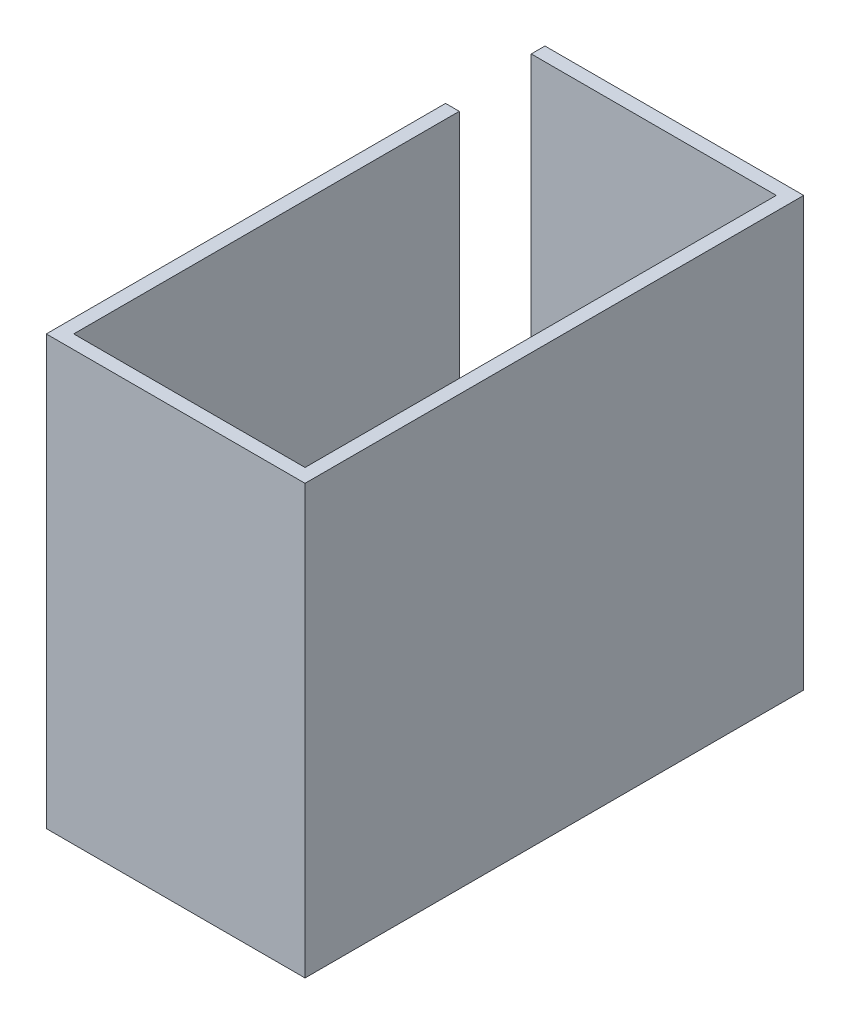
ISO-10303-21;
HEADER;
FILE_DESCRIPTION(('STEP AP214'),'2;1');
FILE_NAME('part.step','',(''),(''),'','','');
FILE_SCHEMA(('AUTOMOTIVE_DESIGN { 1 0 10303 214 1 1 1 1 }'));
ENDSEC;
DATA;
#1=APPLICATION_CONTEXT('core data for automotive mechanical design processes');
#2=APPLICATION_PROTOCOL_DEFINITION('international standard','automotive_design',2000,#1);
#3=PRODUCT_CONTEXT('',#1,'mechanical');
#4=PRODUCT('Part','Part','',(#3));
#5=PRODUCT_RELATED_PRODUCT_CATEGORY('part','',(#4));
#6=PRODUCT_DEFINITION_FORMATION('','',#4);
#7=PRODUCT_DEFINITION_CONTEXT('part definition',#1,'design');
#8=PRODUCT_DEFINITION('design','',#6,#7);
#9=PRODUCT_DEFINITION_SHAPE('','',#8);
#10=(LENGTH_UNIT() NAMED_UNIT(*) SI_UNIT(.MILLI.,.METRE.));
#11=(NAMED_UNIT(*) PLANE_ANGLE_UNIT() SI_UNIT($,.RADIAN.));
#12=(NAMED_UNIT(*) SI_UNIT($,.STERADIAN.) SOLID_ANGLE_UNIT());
#13=UNCERTAINTY_MEASURE_WITH_UNIT(LENGTH_MEASURE(1.E-05),#10,'distance_accuracy_value','');
#14=(GEOMETRIC_REPRESENTATION_CONTEXT(3) GLOBAL_UNCERTAINTY_ASSIGNED_CONTEXT((#13)) GLOBAL_UNIT_ASSIGNED_CONTEXT((#10,
#11,#12)) REPRESENTATION_CONTEXT('',''));
#15=CARTESIAN_POINT('',(0.,0.,0.));
#16=DIRECTION('',(0.,0.,1.));
#17=DIRECTION('',(1.,0.,0.));
#18=AXIS2_PLACEMENT_3D('',#15,#16,#17);
#19=CARTESIAN_POINT('',(0.,50.,-34.1));
#20=DIRECTION('',(0.,0.,1.));
#21=DIRECTION('',(1.,0.,0.));
#22=AXIS2_PLACEMENT_3D('',#19,#20,#21);
#23=PLANE('',#22);
#24=DIRECTION('',(-1.,0.,0.));
#25=VECTOR('',#24,1.);
#26=CARTESIAN_POINT('',(0.,0.,-34.1));
#27=LINE('',#26,#25);
#28=CARTESIAN_POINT('',(15.1,0.,-34.1));
#29=VERTEX_POINT('',#28);
#30=CARTESIAN_POINT('',(-15.1,0.,-34.1));
#31=VERTEX_POINT('',#30);
#32=EDGE_CURVE('E127',#29,#31,#27,.T.);
#33=ORIENTED_EDGE('',*,*,#32,.T.);
#34=DIRECTION('',(0.,-1.,0.));
#35=VECTOR('',#34,1.);
#36=CARTESIAN_POINT('',(-15.1,50.,-34.1));
#37=LINE('',#36,#35);
#38=CARTESIAN_POINT('',(-15.1,50.,-34.1));
#39=VERTEX_POINT('',#38);
#40=EDGE_CURVE('E12',#39,#31,#37,.T.);
#41=ORIENTED_EDGE('',*,*,#40,.F.);
#42=DIRECTION('',(-1.,0.,0.));
#43=VECTOR('',#42,1.);
#44=CARTESIAN_POINT('',(0.,50.,-34.1));
#45=LINE('',#44,#43);
#46=CARTESIAN_POINT('',(15.1,50.,-34.1));
#47=VERTEX_POINT('',#46);
#48=EDGE_CURVE('E135',#47,#39,#45,.T.);
#49=ORIENTED_EDGE('',*,*,#48,.F.);
#50=DIRECTION('',(0.,-1.,0.));
#51=VECTOR('',#50,1.);
#52=CARTESIAN_POINT('',(15.1,50.,-34.1));
#53=LINE('',#52,#51);
#54=EDGE_CURVE('E123',#47,#29,#53,.T.);
#55=ORIENTED_EDGE('',*,*,#54,.T.);
#56=EDGE_LOOP('',(#33,#41,#49,#55));
#57=FACE_BOUND('',#56,.T.);
#58=ADVANCED_FACE('F37',(#57),#23,.F.);
#59=CARTESIAN_POINT('',(0.,50.,-32.5));
#60=DIRECTION('',(0.,0.,1.));
#61=DIRECTION('',(1.,0.,0.));
#62=AXIS2_PLACEMENT_3D('',#59,#60,#61);
#63=PLANE('',#62);
#64=DIRECTION('',(-1.,0.,0.));
#65=VECTOR('',#64,1.);
#66=CARTESIAN_POINT('',(0.,15.,-32.5));
#67=LINE('',#66,#65);
#68=CARTESIAN_POINT('',(13.5,15.,-32.5));
#69=VERTEX_POINT('',#68);
#70=CARTESIAN_POINT('',(-15.1,15.,-32.5));
#71=VERTEX_POINT('',#70);
#72=EDGE_CURVE('E130',#69,#71,#67,.T.);
#73=ORIENTED_EDGE('',*,*,#72,.F.);
#74=DIRECTION('',(0.,-1.,0.));
#75=VECTOR('',#74,1.);
#76=CARTESIAN_POINT('',(13.5,50.,-32.5));
#77=LINE('',#76,#75);
#78=CARTESIAN_POINT('',(13.5,50.,-32.5));
#79=VERTEX_POINT('',#78);
#80=EDGE_CURVE('E148',#79,#69,#77,.T.);
#81=ORIENTED_EDGE('',*,*,#80,.F.);
#82=DIRECTION('',(-1.,0.,0.));
#83=VECTOR('',#82,1.);
#84=CARTESIAN_POINT('',(0.,50.,-32.5));
#85=LINE('',#84,#83);
#86=CARTESIAN_POINT('',(-15.1,50.,-32.5));
#87=VERTEX_POINT('',#86);
#88=EDGE_CURVE('E158',#79,#87,#85,.T.);
#89=ORIENTED_EDGE('',*,*,#88,.T.);
#90=DIRECTION('',(0.,-1.,0.));
#91=VECTOR('',#90,1.);
#92=CARTESIAN_POINT('',(-15.1,50.,-32.5));
#93=LINE('',#92,#91);
#94=EDGE_CURVE('E45',#87,#71,#93,.T.);
#95=ORIENTED_EDGE('',*,*,#94,.T.);
#96=EDGE_LOOP('',(#73,#81,#89,#95));
#97=FACE_BOUND('',#96,.T.);
#98=ADVANCED_FACE('F154',(#97),#63,.T.);
#99=CARTESIAN_POINT('',(13.5,50.,0.));
#100=DIRECTION('',(-1.,0.,0.));
#101=DIRECTION('',(0.,0.,1.));
#102=AXIS2_PLACEMENT_3D('',#99,#100,#101);
#103=PLANE('',#102);
#104=DIRECTION('',(0.,0.,-1.));
#105=VECTOR('',#104,1.);
#106=CARTESIAN_POINT('',(13.5,15.,0.));
#107=LINE('',#106,#105);
#108=CARTESIAN_POINT('',(13.5,15.,22.5));
#109=VERTEX_POINT('',#108);
#110=EDGE_CURVE('E172',#109,#69,#107,.T.);
#111=ORIENTED_EDGE('',*,*,#110,.F.);
#112=DIRECTION('',(0.,-1.,0.));
#113=VECTOR('',#112,1.);
#114=CARTESIAN_POINT('',(13.5,50.,22.5));
#115=LINE('',#114,#113);
#116=CARTESIAN_POINT('',(13.5,50.,22.5));
#117=VERTEX_POINT('',#116);
#118=EDGE_CURVE('E145',#117,#109,#115,.T.);
#119=ORIENTED_EDGE('',*,*,#118,.F.);
#120=DIRECTION('',(0.,0.,-1.));
#121=VECTOR('',#120,1.);
#122=CARTESIAN_POINT('',(13.5,50.,0.));
#123=LINE('',#122,#121);
#124=EDGE_CURVE('E181',#117,#79,#123,.T.);
#125=ORIENTED_EDGE('',*,*,#124,.T.);
#126=ORIENTED_EDGE('',*,*,#80,.T.);
#127=EDGE_LOOP('',(#111,#119,#125,#126));
#128=FACE_BOUND('',#127,.T.);
#129=ADVANCED_FACE('F211',(#128),#103,.T.);
#130=CARTESIAN_POINT('',(0.,50.,22.5));
#131=DIRECTION('',(0.,0.,1.));
#132=DIRECTION('',(1.,0.,0.));
#133=AXIS2_PLACEMENT_3D('',#130,#131,#132);
#134=PLANE('',#133);
#135=ORIENTED_EDGE('',*,*,#118,.T.);
#136=DIRECTION('',(-1.,0.,0.));
#137=VECTOR('',#136,1.);
#138=CARTESIAN_POINT('',(0.,15.,22.5));
#139=LINE('',#138,#137);
#140=CARTESIAN_POINT('',(-13.5,15.,22.5));
#141=VERTEX_POINT('',#140);
#142=EDGE_CURVE('E194',#109,#141,#139,.T.);
#143=ORIENTED_EDGE('',*,*,#142,.T.);
#144=DIRECTION('',(0.,-1.,0.));
#145=VECTOR('',#144,1.);
#146=CARTESIAN_POINT('',(-13.5,50.,22.5));
#147=LINE('',#146,#145);
#148=CARTESIAN_POINT('',(-13.5,50.,22.5));
#149=VERTEX_POINT('',#148);
#150=EDGE_CURVE('E142',#149,#141,#147,.T.);
#151=ORIENTED_EDGE('',*,*,#150,.F.);
#152=DIRECTION('',(-1.,0.,0.));
#153=VECTOR('',#152,1.);
#154=CARTESIAN_POINT('',(0.,50.,22.5));
#155=LINE('',#154,#153);
#156=EDGE_CURVE('E184',#117,#149,#155,.T.);
#157=ORIENTED_EDGE('',*,*,#156,.F.);
#158=EDGE_LOOP('',(#135,#143,#151,#157));
#159=FACE_BOUND('',#158,.T.);
#160=ADVANCED_FACE('F207',(#159),#134,.F.);
#161=CARTESIAN_POINT('',(-13.5,50.,0.));
#162=DIRECTION('',(-1.,0.,0.));
#163=DIRECTION('',(0.,0.,1.));
#164=AXIS2_PLACEMENT_3D('',#161,#162,#163);
#165=PLANE('',#164);
#166=ORIENTED_EDGE('',*,*,#150,.T.);
#167=DIRECTION('',(0.,0.,-1.));
#168=VECTOR('',#167,1.);
#169=CARTESIAN_POINT('',(-13.5,15.,0.));
#170=LINE('',#169,#168);
#171=CARTESIAN_POINT('',(-13.5,15.,-22.5));
#172=VERTEX_POINT('',#171);
#173=EDGE_CURVE('E166',#141,#172,#170,.T.);
#174=ORIENTED_EDGE('',*,*,#173,.T.);
#175=DIRECTION('',(0.,-1.,0.));
#176=VECTOR('',#175,1.);
#177=CARTESIAN_POINT('',(-13.5,50.,-22.5));
#178=LINE('',#177,#176);
#179=CARTESIAN_POINT('',(-13.5,50.,-22.5));
#180=VERTEX_POINT('',#179);
#181=EDGE_CURVE('E139',#180,#172,#178,.T.);
#182=ORIENTED_EDGE('',*,*,#181,.F.);
#183=DIRECTION('',(0.,0.,-1.));
#184=VECTOR('',#183,1.);
#185=CARTESIAN_POINT('',(-13.5,50.,0.));
#186=LINE('',#185,#184);
#187=EDGE_CURVE('E186',#149,#180,#186,.T.);
#188=ORIENTED_EDGE('',*,*,#187,.F.);
#189=EDGE_LOOP('',(#166,#174,#182,#188));
#190=FACE_BOUND('',#189,.T.);
#191=ADVANCED_FACE('F199',(#190),#165,.F.);
#192=CARTESIAN_POINT('',(0.,50.,-22.5));
#193=DIRECTION('',(0.,0.,-1.));
#194=DIRECTION('',(-1.,0.,0.));
#195=AXIS2_PLACEMENT_3D('',#192,#193,#194);
#196=PLANE('',#195);
#197=DIRECTION('',(1.,0.,0.));
#198=VECTOR('',#197,1.);
#199=CARTESIAN_POINT('',(0.,15.,-22.5));
#200=LINE('',#199,#198);
#201=CARTESIAN_POINT('',(-15.1,15.,-22.5));
#202=VERTEX_POINT('',#201);
#203=EDGE_CURVE('E174',#202,#172,#200,.T.);
#204=ORIENTED_EDGE('',*,*,#203,.F.);
#205=DIRECTION('',(0.,-1.,0.));
#206=VECTOR('',#205,1.);
#207=CARTESIAN_POINT('',(-15.1,50.,-22.5));
#208=LINE('',#207,#206);
#209=CARTESIAN_POINT('',(-15.1,50.,-22.5));
#210=VERTEX_POINT('',#209);
#211=EDGE_CURVE('E113',#210,#202,#208,.T.);
#212=ORIENTED_EDGE('',*,*,#211,.F.);
#213=DIRECTION('',(1.,0.,0.));
#214=VECTOR('',#213,1.);
#215=CARTESIAN_POINT('',(0.,50.,-22.5));
#216=LINE('',#215,#214);
#217=EDGE_CURVE('E119',#210,#180,#216,.T.);
#218=ORIENTED_EDGE('',*,*,#217,.T.);
#219=ORIENTED_EDGE('',*,*,#181,.T.);
#220=EDGE_LOOP('',(#204,#212,#218,#219));
#221=FACE_BOUND('',#220,.T.);
#222=ADVANCED_FACE('F188',(#221),#196,.T.);
#223=CARTESIAN_POINT('',(-15.1,50.,0.));
#224=DIRECTION('',(-1.,0.,0.));
#225=DIRECTION('',(0.,0.,1.));
#226=AXIS2_PLACEMENT_3D('',#223,#224,#225);
#227=PLANE('',#226);
#228=DIRECTION('',(0.,0.,-1.));
#229=VECTOR('',#228,1.);
#230=CARTESIAN_POINT('',(-15.1,0.,0.));
#231=LINE('',#230,#229);
#232=CARTESIAN_POINT('',(-15.1,0.,24.1));
#233=VERTEX_POINT('',#232);
#234=EDGE_CURVE('E108',#233,#31,#231,.T.);
#235=ORIENTED_EDGE('',*,*,#234,.F.);
#236=DIRECTION('',(0.,-1.,0.));
#237=VECTOR('',#236,1.);
#238=CARTESIAN_POINT('',(-15.1,50.,24.1));
#239=LINE('',#238,#237);
#240=CARTESIAN_POINT('',(-15.1,50.,24.1));
#241=VERTEX_POINT('',#240);
#242=EDGE_CURVE('E103',#241,#233,#239,.T.);
#243=ORIENTED_EDGE('',*,*,#242,.F.);
#244=DIRECTION('',(0.,0.,-1.));
#245=VECTOR('',#244,1.);
#246=CARTESIAN_POINT('',(-15.1,50.,0.));
#247=LINE('',#246,#245);
#248=EDGE_CURVE('E107',#241,#210,#247,.T.);
#249=ORIENTED_EDGE('',*,*,#248,.T.);
#250=ORIENTED_EDGE('',*,*,#211,.T.);
#251=DIRECTION('',(0.,0.,-1.));
#252=VECTOR('',#251,1.);
#253=CARTESIAN_POINT('',(-15.1,15.,0.));
#254=LINE('',#253,#252);
#255=EDGE_CURVE('E161',#202,#71,#254,.T.);
#256=ORIENTED_EDGE('',*,*,#255,.T.);
#257=ORIENTED_EDGE('',*,*,#94,.F.);
#258=DIRECTION('',(0.,0.,1.));
#259=VECTOR('',#258,1.);
#260=CARTESIAN_POINT('',(-15.1,50.,0.));
#261=LINE('',#260,#259);
#262=EDGE_CURVE('E81',#39,#87,#261,.T.);
#263=ORIENTED_EDGE('',*,*,#262,.F.);
#264=ORIENTED_EDGE('',*,*,#40,.T.);
#265=EDGE_LOOP('',(#235,#243,#249,#250,#256,#257,#263,#264));
#266=FACE_BOUND('',#265,.T.);
#267=ADVANCED_FACE('F105',(#266),#227,.T.);
#268=CARTESIAN_POINT('',(0.,50.,24.1));
#269=DIRECTION('',(0.,0.,1.));
#270=DIRECTION('',(1.,0.,0.));
#271=AXIS2_PLACEMENT_3D('',#268,#269,#270);
#272=PLANE('',#271);
#273=DIRECTION('',(-1.,0.,0.));
#274=VECTOR('',#273,1.);
#275=CARTESIAN_POINT('',(0.,0.,24.1));
#276=LINE('',#275,#274);
#277=CARTESIAN_POINT('',(15.1,0.,24.1));
#278=VERTEX_POINT('',#277);
#279=EDGE_CURVE('E132',#278,#233,#276,.T.);
#280=ORIENTED_EDGE('',*,*,#279,.F.);
#281=DIRECTION('',(0.,-1.,0.));
#282=VECTOR('',#281,1.);
#283=CARTESIAN_POINT('',(15.1,50.,24.1));
#284=LINE('',#283,#282);
#285=CARTESIAN_POINT('',(15.1,50.,24.1));
#286=VERTEX_POINT('',#285);
#287=EDGE_CURVE('E70',#286,#278,#284,.T.);
#288=ORIENTED_EDGE('',*,*,#287,.F.);
#289=DIRECTION('',(-1.,0.,0.));
#290=VECTOR('',#289,1.);
#291=CARTESIAN_POINT('',(0.,50.,24.1));
#292=LINE('',#291,#290);
#293=EDGE_CURVE('E117',#286,#241,#292,.T.);
#294=ORIENTED_EDGE('',*,*,#293,.T.);
#295=ORIENTED_EDGE('',*,*,#242,.T.);
#296=EDGE_LOOP('',(#280,#288,#294,#295));
#297=FACE_BOUND('',#296,.T.);
#298=ADVANCED_FACE('F121',(#297),#272,.T.);
#299=CARTESIAN_POINT('',(15.1,50.,0.));
#300=DIRECTION('',(-1.,0.,0.));
#301=DIRECTION('',(0.,0.,1.));
#302=AXIS2_PLACEMENT_3D('',#299,#300,#301);
#303=PLANE('',#302);
#304=DIRECTION('',(0.,0.,-1.));
#305=VECTOR('',#304,1.);
#306=CARTESIAN_POINT('',(15.1,0.,0.));
#307=LINE('',#306,#305);
#308=EDGE_CURVE('E73',#278,#29,#307,.T.);
#309=ORIENTED_EDGE('',*,*,#308,.T.);
#310=ORIENTED_EDGE('',*,*,#54,.F.);
#311=DIRECTION('',(0.,0.,-1.));
#312=VECTOR('',#311,1.);
#313=CARTESIAN_POINT('',(15.1,50.,0.));
#314=LINE('',#313,#312);
#315=EDGE_CURVE('E53',#286,#47,#314,.T.);
#316=ORIENTED_EDGE('',*,*,#315,.F.);
#317=ORIENTED_EDGE('',*,*,#287,.T.);
#318=EDGE_LOOP('',(#309,#310,#316,#317));
#319=FACE_BOUND('',#318,.T.);
#320=ADVANCED_FACE('F226',(#319),#303,.F.);
#321=CARTESIAN_POINT('',(0.,50.,0.));
#322=DIRECTION('',(0.,1.,0.));
#323=DIRECTION('',(0.,0.,1.));
#324=AXIS2_PLACEMENT_3D('',#321,#322,#323);
#325=PLANE('',#324);
#326=ORIENTED_EDGE('',*,*,#48,.T.);
#327=ORIENTED_EDGE('',*,*,#262,.T.);
#328=ORIENTED_EDGE('',*,*,#88,.F.);
#329=ORIENTED_EDGE('',*,*,#124,.F.);
#330=ORIENTED_EDGE('',*,*,#156,.T.);
#331=ORIENTED_EDGE('',*,*,#187,.T.);
#332=ORIENTED_EDGE('',*,*,#217,.F.);
#333=ORIENTED_EDGE('',*,*,#248,.F.);
#334=ORIENTED_EDGE('',*,*,#293,.F.);
#335=ORIENTED_EDGE('',*,*,#315,.T.);
#336=EDGE_LOOP('',(#326,#327,#328,#329,#330,#331,#332,#333,#334,#335));
#337=FACE_BOUND('',#336,.T.);
#338=ADVANCED_FACE('F116',(#337),#325,.T.);
#339=CARTESIAN_POINT('',(0.,0.,0.));
#340=DIRECTION('',(0.,1.,0.));
#341=DIRECTION('',(0.,0.,1.));
#342=AXIS2_PLACEMENT_3D('',#339,#340,#341);
#343=PLANE('',#342);
#344=ORIENTED_EDGE('',*,*,#234,.T.);
#345=ORIENTED_EDGE('',*,*,#32,.F.);
#346=ORIENTED_EDGE('',*,*,#308,.F.);
#347=ORIENTED_EDGE('',*,*,#279,.T.);
#348=EDGE_LOOP('',(#344,#345,#346,#347));
#349=FACE_BOUND('',#348,.T.);
#350=ADVANCED_FACE('F218',(#349),#343,.F.);
#351=CARTESIAN_POINT('',(0.,15.,0.));
#352=DIRECTION('',(0.,1.,0.));
#353=DIRECTION('',(0.,0.,1.));
#354=AXIS2_PLACEMENT_3D('',#351,#352,#353);
#355=PLANE('',#354);
#356=ORIENTED_EDGE('',*,*,#255,.F.);
#357=ORIENTED_EDGE('',*,*,#203,.T.);
#358=ORIENTED_EDGE('',*,*,#173,.F.);
#359=ORIENTED_EDGE('',*,*,#142,.F.);
#360=ORIENTED_EDGE('',*,*,#110,.T.);
#361=ORIENTED_EDGE('',*,*,#72,.T.);
#362=EDGE_LOOP('',(#356,#357,#358,#359,#360,#361));
#363=FACE_BOUND('',#362,.T.);
#364=ADVANCED_FACE('F169',(#363),#355,.T.);
#365=CLOSED_SHELL('',(#58,#98,#129,#160,#191,#222,#267,#298,#320,#338,#350,#364));
#366=MANIFOLD_SOLID_BREP('B2',#365);
#367=ADVANCED_BREP_SHAPE_REPRESENTATION('',(#18,#366),#14);
#368=SHAPE_DEFINITION_REPRESENTATION(#9,#367);
ENDSEC;
END-ISO-10303-21;
